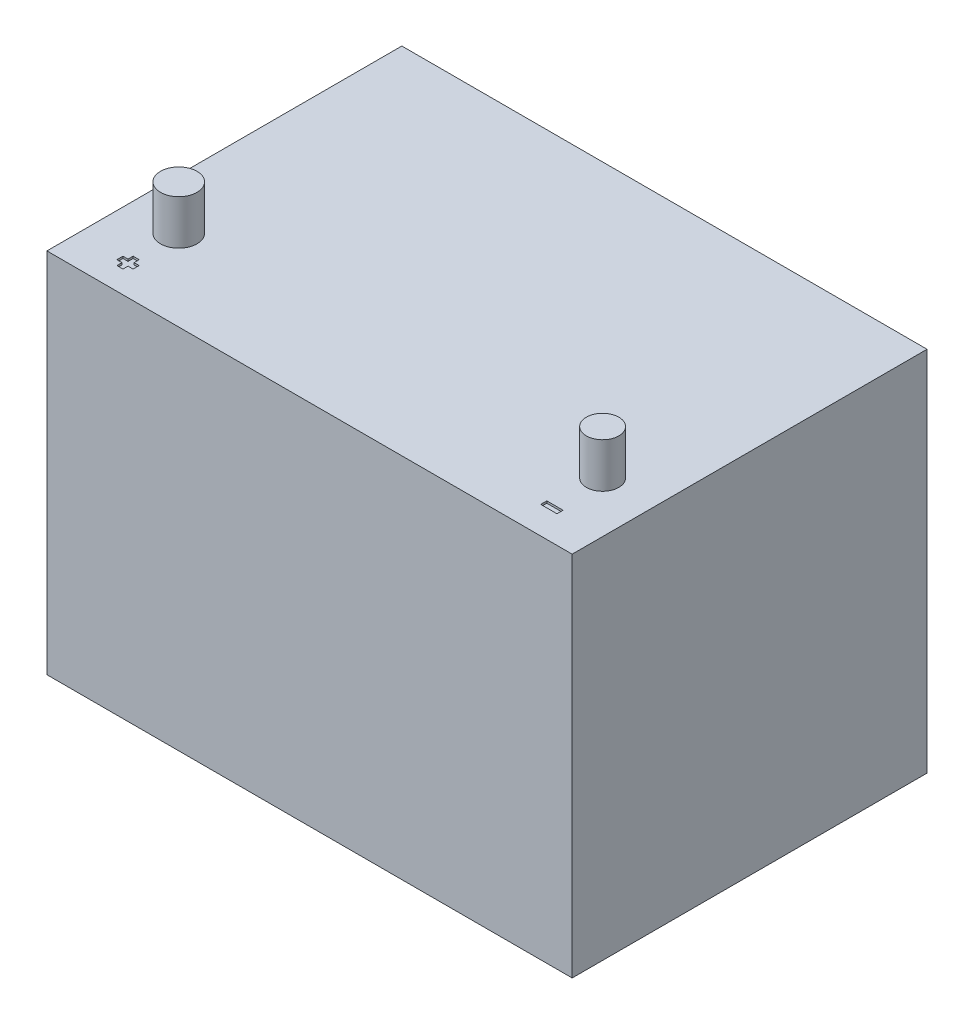
ISO-10303-21;
HEADER;
FILE_DESCRIPTION(('STEP AP214'),'2;1');
FILE_NAME('part.step','',(''),(''),'','','');
FILE_SCHEMA(('AUTOMOTIVE_DESIGN { 1 0 10303 214 1 1 1 1 }'));
ENDSEC;
DATA;
#1=APPLICATION_CONTEXT('core data for automotive mechanical design processes');
#2=APPLICATION_PROTOCOL_DEFINITION('international standard','automotive_design',2000,#1);
#3=PRODUCT_CONTEXT('',#1,'mechanical');
#4=PRODUCT('Part','Part','',(#3));
#5=PRODUCT_RELATED_PRODUCT_CATEGORY('part','',(#4));
#6=PRODUCT_DEFINITION_FORMATION('','',#4);
#7=PRODUCT_DEFINITION_CONTEXT('part definition',#1,'design');
#8=PRODUCT_DEFINITION('design','',#6,#7);
#9=PRODUCT_DEFINITION_SHAPE('','',#8);
#10=(LENGTH_UNIT() NAMED_UNIT(*) SI_UNIT(.MILLI.,.METRE.));
#11=(NAMED_UNIT(*) PLANE_ANGLE_UNIT() SI_UNIT($,.RADIAN.));
#12=(NAMED_UNIT(*) SI_UNIT($,.STERADIAN.) SOLID_ANGLE_UNIT());
#13=UNCERTAINTY_MEASURE_WITH_UNIT(LENGTH_MEASURE(1.E-05),#10,'distance_accuracy_value','');
#14=(GEOMETRIC_REPRESENTATION_CONTEXT(3) GLOBAL_UNCERTAINTY_ASSIGNED_CONTEXT((#13)) GLOBAL_UNIT_ASSIGNED_CONTEXT((#10,
#11,#12)) REPRESENTATION_CONTEXT('',''));
#15=CARTESIAN_POINT('',(0.,0.,0.));
#16=DIRECTION('',(0.,0.,1.));
#17=DIRECTION('',(1.,0.,0.));
#18=AXIS2_PLACEMENT_3D('',#15,#16,#17);
#19=CARTESIAN_POINT('',(129.5,181.,-87.5));
#20=DIRECTION('',(-1.,0.,0.));
#21=DIRECTION('',(0.,0.,1.));
#22=AXIS2_PLACEMENT_3D('',#19,#20,#21);
#23=PLANE('',#22);
#24=DIRECTION('',(0.,0.,-1.));
#25=VECTOR('',#24,1.);
#26=CARTESIAN_POINT('',(129.5,0.,-87.5));
#27=LINE('',#26,#25);
#28=CARTESIAN_POINT('',(129.5,0.,87.5));
#29=VERTEX_POINT('',#28);
#30=CARTESIAN_POINT('',(129.5,0.,-87.5));
#31=VERTEX_POINT('',#30);
#32=EDGE_CURVE('E303',#29,#31,#27,.T.);
#33=ORIENTED_EDGE('',*,*,#32,.T.);
#34=DIRECTION('',(0.,-1.,0.));
#35=VECTOR('',#34,1.);
#36=CARTESIAN_POINT('',(129.5,181.,-87.5));
#37=LINE('',#36,#35);
#38=CARTESIAN_POINT('',(129.5,181.,-87.5));
#39=VERTEX_POINT('',#38);
#40=EDGE_CURVE('E11',#39,#31,#37,.T.);
#41=ORIENTED_EDGE('',*,*,#40,.F.);
#42=DIRECTION('',(0.,0.,-1.));
#43=VECTOR('',#42,1.);
#44=CARTESIAN_POINT('',(129.5,181.,-87.5));
#45=LINE('',#44,#43);
#46=CARTESIAN_POINT('',(129.5,181.,87.5));
#47=VERTEX_POINT('',#46);
#48=EDGE_CURVE('E306',#47,#39,#45,.T.);
#49=ORIENTED_EDGE('',*,*,#48,.F.);
#50=DIRECTION('',(0.,-1.,0.));
#51=VECTOR('',#50,1.);
#52=CARTESIAN_POINT('',(129.5,181.,87.5));
#53=LINE('',#52,#51);
#54=EDGE_CURVE('E316',#47,#29,#53,.T.);
#55=ORIENTED_EDGE('',*,*,#54,.T.);
#56=EDGE_LOOP('',(#33,#41,#49,#55));
#57=FACE_BOUND('',#56,.T.);
#58=ADVANCED_FACE('F33',(#57),#23,.F.);
#59=CARTESIAN_POINT('',(-129.5,181.,-87.5));
#60=DIRECTION('',(0.,0.,1.));
#61=DIRECTION('',(1.,0.,0.));
#62=AXIS2_PLACEMENT_3D('',#59,#60,#61);
#63=PLANE('',#62);
#64=DIRECTION('',(-1.,0.,0.));
#65=VECTOR('',#64,1.);
#66=CARTESIAN_POINT('',(-129.5,0.,-87.5));
#67=LINE('',#66,#65);
#68=CARTESIAN_POINT('',(-129.5,0.,-87.5));
#69=VERTEX_POINT('',#68);
#70=EDGE_CURVE('E319',#31,#69,#67,.T.);
#71=ORIENTED_EDGE('',*,*,#70,.T.);
#72=DIRECTION('',(0.,-1.,0.));
#73=VECTOR('',#72,1.);
#74=CARTESIAN_POINT('',(-129.5,181.,-87.5));
#75=LINE('',#74,#73);
#76=CARTESIAN_POINT('',(-129.5,181.,-87.5));
#77=VERTEX_POINT('',#76);
#78=EDGE_CURVE('E40',#77,#69,#75,.T.);
#79=ORIENTED_EDGE('',*,*,#78,.F.);
#80=DIRECTION('',(-1.,0.,0.));
#81=VECTOR('',#80,1.);
#82=CARTESIAN_POINT('',(-129.5,181.,-87.5));
#83=LINE('',#82,#81);
#84=EDGE_CURVE('E309',#39,#77,#83,.T.);
#85=ORIENTED_EDGE('',*,*,#84,.F.);
#86=ORIENTED_EDGE('',*,*,#40,.T.);
#87=EDGE_LOOP('',(#71,#79,#85,#86));
#88=FACE_BOUND('',#87,.T.);
#89=ADVANCED_FACE('F349',(#88),#63,.F.);
#90=CARTESIAN_POINT('',(-129.5,181.,-87.5));
#91=DIRECTION('',(1.,0.,0.));
#92=DIRECTION('',(0.,0.,-1.));
#93=AXIS2_PLACEMENT_3D('',#90,#91,#92);
#94=PLANE('',#93);
#95=DIRECTION('',(0.,0.,1.));
#96=VECTOR('',#95,1.);
#97=CARTESIAN_POINT('',(-129.5,0.,-87.5));
#98=LINE('',#97,#96);
#99=CARTESIAN_POINT('',(-129.5,0.,87.5));
#100=VERTEX_POINT('',#99);
#101=EDGE_CURVE('E321',#69,#100,#98,.T.);
#102=ORIENTED_EDGE('',*,*,#101,.T.);
#103=DIRECTION('',(0.,-1.,0.));
#104=VECTOR('',#103,1.);
#105=CARTESIAN_POINT('',(-129.5,181.,87.5));
#106=LINE('',#105,#104);
#107=CARTESIAN_POINT('',(-129.5,181.,87.5));
#108=VERTEX_POINT('',#107);
#109=EDGE_CURVE('E326',#108,#100,#106,.T.);
#110=ORIENTED_EDGE('',*,*,#109,.F.);
#111=DIRECTION('',(0.,0.,1.));
#112=VECTOR('',#111,1.);
#113=CARTESIAN_POINT('',(-129.5,181.,-87.5));
#114=LINE('',#113,#112);
#115=EDGE_CURVE('E312',#77,#108,#114,.T.);
#116=ORIENTED_EDGE('',*,*,#115,.F.);
#117=ORIENTED_EDGE('',*,*,#78,.T.);
#118=EDGE_LOOP('',(#102,#110,#116,#117));
#119=FACE_BOUND('',#118,.T.);
#120=ADVANCED_FACE('F333',(#119),#94,.F.);
#121=CARTESIAN_POINT('',(-129.5,181.,87.5));
#122=DIRECTION('',(0.,0.,-1.));
#123=DIRECTION('',(-1.,0.,0.));
#124=AXIS2_PLACEMENT_3D('',#121,#122,#123);
#125=PLANE('',#124);
#126=DIRECTION('',(1.,0.,0.));
#127=VECTOR('',#126,1.);
#128=CARTESIAN_POINT('',(-129.5,0.,87.5));
#129=LINE('',#128,#127);
#130=EDGE_CURVE('E310',#100,#29,#129,.T.);
#131=ORIENTED_EDGE('',*,*,#130,.T.);
#132=ORIENTED_EDGE('',*,*,#54,.F.);
#133=DIRECTION('',(1.,0.,0.));
#134=VECTOR('',#133,1.);
#135=CARTESIAN_POINT('',(-129.5,181.,87.5));
#136=LINE('',#135,#134);
#137=EDGE_CURVE('E314',#108,#47,#136,.T.);
#138=ORIENTED_EDGE('',*,*,#137,.F.);
#139=ORIENTED_EDGE('',*,*,#109,.T.);
#140=EDGE_LOOP('',(#131,#132,#138,#139));
#141=FACE_BOUND('',#140,.T.);
#142=ADVANCED_FACE('F342',(#141),#125,.F.);
#143=CARTESIAN_POINT('',(0.,181.,0.));
#144=DIRECTION('',(0.,1.,0.));
#145=DIRECTION('',(0.,0.,1.));
#146=AXIS2_PLACEMENT_3D('',#143,#144,#145);
#147=PLANE('',#146);
#148=DIRECTION('',(0.,0.,1.));
#149=VECTOR('',#148,1.);
#150=CARTESIAN_POINT('',(-108.5,181.,0.));
#151=LINE('',#150,#149);
#152=CARTESIAN_POINT('',(-108.5,181.,71.));
#153=VERTEX_POINT('',#152);
#154=CARTESIAN_POINT('',(-108.5,181.,74.));
#155=VERTEX_POINT('',#154);
#156=EDGE_CURVE('E47',#153,#155,#151,.T.);
#157=ORIENTED_EDGE('',*,*,#156,.F.);
#158=DIRECTION('',(1.,0.,0.));
#159=VECTOR('',#158,1.);
#160=CARTESIAN_POINT('',(0.,181.,71.));
#161=LINE('',#160,#159);
#162=CARTESIAN_POINT('',(-106.,181.,71.));
#163=VERTEX_POINT('',#162);
#164=EDGE_CURVE('E189',#153,#163,#161,.T.);
#165=ORIENTED_EDGE('',*,*,#164,.T.);
#166=DIRECTION('',(0.,0.,1.));
#167=VECTOR('',#166,1.);
#168=CARTESIAN_POINT('',(-106.,181.,0.));
#169=LINE('',#168,#167);
#170=CARTESIAN_POINT('',(-106.,181.,68.5));
#171=VERTEX_POINT('',#170);
#172=EDGE_CURVE('E192',#171,#163,#169,.T.);
#173=ORIENTED_EDGE('',*,*,#172,.F.);
#174=DIRECTION('',(1.,0.,0.));
#175=VECTOR('',#174,1.);
#176=CARTESIAN_POINT('',(0.,181.,68.5));
#177=LINE('',#176,#175);
#178=CARTESIAN_POINT('',(-103.,181.,68.5));
#179=VERTEX_POINT('',#178);
#180=EDGE_CURVE('E240',#171,#179,#177,.T.);
#181=ORIENTED_EDGE('',*,*,#180,.T.);
#182=DIRECTION('',(0.,0.,1.));
#183=VECTOR('',#182,1.);
#184=CARTESIAN_POINT('',(-103.,181.,0.));
#185=LINE('',#184,#183);
#186=CARTESIAN_POINT('',(-103.,181.,71.));
#187=VERTEX_POINT('',#186);
#188=EDGE_CURVE('E237',#179,#187,#185,.T.);
#189=ORIENTED_EDGE('',*,*,#188,.T.);
#190=DIRECTION('',(1.,0.,0.));
#191=VECTOR('',#190,1.);
#192=CARTESIAN_POINT('',(0.,181.,71.));
#193=LINE('',#192,#191);
#194=CARTESIAN_POINT('',(-100.5,181.,71.));
#195=VERTEX_POINT('',#194);
#196=EDGE_CURVE('E234',#187,#195,#193,.T.);
#197=ORIENTED_EDGE('',*,*,#196,.T.);
#198=DIRECTION('',(0.,0.,1.));
#199=VECTOR('',#198,1.);
#200=CARTESIAN_POINT('',(-100.5,181.,0.));
#201=LINE('',#200,#199);
#202=CARTESIAN_POINT('',(-100.5,181.,74.));
#203=VERTEX_POINT('',#202);
#204=EDGE_CURVE('E231',#195,#203,#201,.T.);
#205=ORIENTED_EDGE('',*,*,#204,.T.);
#206=DIRECTION('',(1.,0.,0.));
#207=VECTOR('',#206,1.);
#208=CARTESIAN_POINT('',(0.,181.,74.));
#209=LINE('',#208,#207);
#210=CARTESIAN_POINT('',(-103.,181.,74.));
#211=VERTEX_POINT('',#210);
#212=EDGE_CURVE('E228',#211,#203,#209,.T.);
#213=ORIENTED_EDGE('',*,*,#212,.F.);
#214=DIRECTION('',(0.,0.,1.));
#215=VECTOR('',#214,1.);
#216=CARTESIAN_POINT('',(-103.,181.,0.));
#217=LINE('',#216,#215);
#218=CARTESIAN_POINT('',(-103.,181.,76.5));
#219=VERTEX_POINT('',#218);
#220=EDGE_CURVE('E225',#211,#219,#217,.T.);
#221=ORIENTED_EDGE('',*,*,#220,.T.);
#222=DIRECTION('',(1.,0.,0.));
#223=VECTOR('',#222,1.);
#224=CARTESIAN_POINT('',(0.,181.,76.5));
#225=LINE('',#224,#223);
#226=CARTESIAN_POINT('',(-106.,181.,76.5));
#227=VERTEX_POINT('',#226);
#228=EDGE_CURVE('E222',#227,#219,#225,.T.);
#229=ORIENTED_EDGE('',*,*,#228,.F.);
#230=DIRECTION('',(0.,0.,1.));
#231=VECTOR('',#230,1.);
#232=CARTESIAN_POINT('',(-106.,181.,0.));
#233=LINE('',#232,#231);
#234=CARTESIAN_POINT('',(-106.,181.,74.));
#235=VERTEX_POINT('',#234);
#236=EDGE_CURVE('E219',#235,#227,#233,.T.);
#237=ORIENTED_EDGE('',*,*,#236,.F.);
#238=DIRECTION('',(1.,0.,0.));
#239=VECTOR('',#238,1.);
#240=CARTESIAN_POINT('',(0.,181.,74.));
#241=LINE('',#240,#239);
#242=EDGE_CURVE('E216',#155,#235,#241,.T.);
#243=ORIENTED_EDGE('',*,*,#242,.F.);
#244=EDGE_LOOP('',(#157,#165,#173,#181,#189,#197,#205,#213,#221,#229,#237,#243));
#245=FACE_BOUND('',#244,.T.);
#246=DIRECTION('',(1.,0.,0.));
#247=VECTOR('',#246,1.);
#248=CARTESIAN_POINT('',(0.,181.,74.));
#249=LINE('',#248,#247);
#250=CARTESIAN_POINT('',(100.5,181.,74.));
#251=VERTEX_POINT('',#250);
#252=CARTESIAN_POINT('',(108.5,181.,74.));
#253=VERTEX_POINT('',#252);
#254=EDGE_CURVE('E55',#251,#253,#249,.T.);
#255=ORIENTED_EDGE('',*,*,#254,.F.);
#256=DIRECTION('',(0.,0.,-1.));
#257=VECTOR('',#256,1.);
#258=CARTESIAN_POINT('',(100.5,181.,0.));
#259=LINE('',#258,#257);
#260=CARTESIAN_POINT('',(100.5,181.,71.));
#261=VERTEX_POINT('',#260);
#262=EDGE_CURVE('E271',#251,#261,#259,.T.);
#263=ORIENTED_EDGE('',*,*,#262,.T.);
#264=DIRECTION('',(1.,0.,0.));
#265=VECTOR('',#264,1.);
#266=CARTESIAN_POINT('',(0.,181.,71.));
#267=LINE('',#266,#265);
#268=CARTESIAN_POINT('',(108.5,181.,71.));
#269=VERTEX_POINT('',#268);
#270=EDGE_CURVE('E283',#261,#269,#267,.T.);
#271=ORIENTED_EDGE('',*,*,#270,.T.);
#272=DIRECTION('',(0.,0.,-1.));
#273=VECTOR('',#272,1.);
#274=CARTESIAN_POINT('',(108.5,181.,0.));
#275=LINE('',#274,#273);
#276=EDGE_CURVE('E280',#253,#269,#275,.T.);
#277=ORIENTED_EDGE('',*,*,#276,.F.);
#278=EDGE_LOOP('',(#255,#263,#271,#277));
#279=FACE_BOUND('',#278,.T.);
#280=CARTESIAN_POINT('',(104.5,181.,47.5));
#281=DIRECTION('',(0.,1.,0.));
#282=DIRECTION('',(0.,0.,1.));
#283=AXIS2_PLACEMENT_3D('',#280,#281,#282);
#284=CIRCLE('',#283,8.00000000000001);
#285=CARTESIAN_POINT('',(104.5,181.,55.5));
#286=VERTEX_POINT('',#285);
#287=EDGE_CURVE('E247',#286,#286,#284,.T.);
#288=ORIENTED_EDGE('',*,*,#287,.F.);
#289=EDGE_LOOP('',(#288));
#290=FACE_BOUND('',#289,.T.);
#291=CARTESIAN_POINT('',(-104.5,181.,47.5));
#292=DIRECTION('',(0.,1.,0.));
#293=DIRECTION('',(0.,0.,1.));
#294=AXIS2_PLACEMENT_3D('',#291,#292,#293);
#295=CIRCLE('',#294,9.);
#296=CARTESIAN_POINT('',(-104.5,181.,56.5));
#297=VERTEX_POINT('',#296);
#298=EDGE_CURVE('E297',#297,#297,#295,.T.);
#299=ORIENTED_EDGE('',*,*,#298,.F.);
#300=EDGE_LOOP('',(#299));
#301=FACE_BOUND('',#300,.T.);
#302=ORIENTED_EDGE('',*,*,#48,.T.);
#303=ORIENTED_EDGE('',*,*,#84,.T.);
#304=ORIENTED_EDGE('',*,*,#115,.T.);
#305=ORIENTED_EDGE('',*,*,#137,.T.);
#306=EDGE_LOOP('',(#302,#303,#304,#305));
#307=FACE_BOUND('',#306,.T.);
#308=ADVANCED_FACE('F348',(#245,#279,#290,#301,#307),#147,.T.);
#309=CARTESIAN_POINT('',(0.,0.,0.));
#310=DIRECTION('',(0.,1.,0.));
#311=DIRECTION('',(0.,0.,1.));
#312=AXIS2_PLACEMENT_3D('',#309,#310,#311);
#313=PLANE('',#312);
#314=ORIENTED_EDGE('',*,*,#32,.F.);
#315=ORIENTED_EDGE('',*,*,#130,.F.);
#316=ORIENTED_EDGE('',*,*,#101,.F.);
#317=ORIENTED_EDGE('',*,*,#70,.F.);
#318=EDGE_LOOP('',(#314,#315,#316,#317));
#319=FACE_BOUND('',#318,.T.);
#320=ADVANCED_FACE('F339',(#319),#313,.F.);
#321=CARTESIAN_POINT('',(-104.5,203.,47.5));
#322=DIRECTION('',(0.,-1.,0.));
#323=DIRECTION('',(0.,0.,-1.));
#324=AXIS2_PLACEMENT_3D('',#321,#322,#323);
#325=CYLINDRICAL_SURFACE('',#324,9.);
#326=CARTESIAN_POINT('',(-104.5,203.,47.5));
#327=DIRECTION('',(0.,1.,0.));
#328=DIRECTION('',(0.,0.,1.));
#329=AXIS2_PLACEMENT_3D('',#326,#327,#328);
#330=CIRCLE('',#329,9.);
#331=CARTESIAN_POINT('',(-104.5,203.,56.5));
#332=VERTEX_POINT('',#331);
#333=EDGE_CURVE('E300',#332,#332,#330,.T.);
#334=ORIENTED_EDGE('',*,*,#333,.F.);
#335=EDGE_LOOP('',(#334));
#336=FACE_BOUND('',#335,.T.);
#337=ORIENTED_EDGE('',*,*,#298,.T.);
#338=EDGE_LOOP('',(#337));
#339=FACE_BOUND('',#338,.T.);
#340=ADVANCED_FACE('F361',(#336,#339),#325,.T.);
#341=CARTESIAN_POINT('',(-104.5,203.,47.5));
#342=DIRECTION('',(0.,1.,0.));
#343=DIRECTION('',(0.,0.,1.));
#344=AXIS2_PLACEMENT_3D('',#341,#342,#343);
#345=PLANE('',#344);
#346=ORIENTED_EDGE('',*,*,#333,.T.);
#347=EDGE_LOOP('',(#346));
#348=FACE_BOUND('',#347,.T.);
#349=ADVANCED_FACE('F367',(#348),#345,.T.);
#350=CARTESIAN_POINT('',(104.5,203.,47.5));
#351=DIRECTION('',(0.,-1.,0.));
#352=DIRECTION('',(0.,0.,-1.));
#353=AXIS2_PLACEMENT_3D('',#350,#351,#352);
#354=CYLINDRICAL_SURFACE('',#353,8.00000000000001);
#355=CARTESIAN_POINT('',(104.5,203.,47.5));
#356=DIRECTION('',(0.,1.,0.));
#357=DIRECTION('',(0.,0.,1.));
#358=AXIS2_PLACEMENT_3D('',#355,#356,#357);
#359=CIRCLE('',#358,8.00000000000001);
#360=CARTESIAN_POINT('',(104.5,203.,55.5));
#361=VERTEX_POINT('',#360);
#362=EDGE_CURVE('E294',#361,#361,#359,.T.);
#363=ORIENTED_EDGE('',*,*,#362,.F.);
#364=EDGE_LOOP('',(#363));
#365=FACE_BOUND('',#364,.T.);
#366=ORIENTED_EDGE('',*,*,#287,.T.);
#367=EDGE_LOOP('',(#366));
#368=FACE_BOUND('',#367,.T.);
#369=ADVANCED_FACE('F371',(#365,#368),#354,.T.);
#370=CARTESIAN_POINT('',(104.5,203.,47.5));
#371=DIRECTION('',(0.,1.,0.));
#372=DIRECTION('',(0.,0.,1.));
#373=AXIS2_PLACEMENT_3D('',#370,#371,#372);
#374=PLANE('',#373);
#375=ORIENTED_EDGE('',*,*,#362,.T.);
#376=EDGE_LOOP('',(#375));
#377=FACE_BOUND('',#376,.T.);
#378=ADVANCED_FACE('F375',(#377),#374,.T.);
#379=CARTESIAN_POINT('',(0.,180.,74.));
#380=DIRECTION('',(0.,0.,1.));
#381=DIRECTION('',(1.,0.,0.));
#382=AXIS2_PLACEMENT_3D('',#379,#380,#381);
#383=PLANE('',#382);
#384=ORIENTED_EDGE('',*,*,#254,.T.);
#385=DIRECTION('',(0.,1.,0.));
#386=VECTOR('',#385,1.);
#387=CARTESIAN_POINT('',(108.5,180.,74.));
#388=LINE('',#387,#386);
#389=CARTESIAN_POINT('',(108.5,180.,74.));
#390=VERTEX_POINT('',#389);
#391=EDGE_CURVE('E278',#390,#253,#388,.T.);
#392=ORIENTED_EDGE('',*,*,#391,.F.);
#393=DIRECTION('',(1.,0.,0.));
#394=VECTOR('',#393,1.);
#395=CARTESIAN_POINT('',(0.,180.,74.));
#396=LINE('',#395,#394);
#397=CARTESIAN_POINT('',(100.5,180.,74.));
#398=VERTEX_POINT('',#397);
#399=EDGE_CURVE('E267',#398,#390,#396,.T.);
#400=ORIENTED_EDGE('',*,*,#399,.F.);
#401=DIRECTION('',(0.,1.,0.));
#402=VECTOR('',#401,1.);
#403=CARTESIAN_POINT('',(100.5,180.,74.));
#404=LINE('',#403,#402);
#405=EDGE_CURVE('E217',#398,#251,#404,.T.);
#406=ORIENTED_EDGE('',*,*,#405,.T.);
#407=EDGE_LOOP('',(#384,#392,#400,#406));
#408=FACE_BOUND('',#407,.T.);
#409=ADVANCED_FACE('F379',(#408),#383,.F.);
#410=CARTESIAN_POINT('',(100.5,180.,0.));
#411=DIRECTION('',(1.,0.,0.));
#412=DIRECTION('',(0.,0.,-1.));
#413=AXIS2_PLACEMENT_3D('',#410,#411,#412);
#414=PLANE('',#413);
#415=ORIENTED_EDGE('',*,*,#262,.F.);
#416=ORIENTED_EDGE('',*,*,#405,.F.);
#417=DIRECTION('',(0.,0.,-1.));
#418=VECTOR('',#417,1.);
#419=CARTESIAN_POINT('',(100.5,180.,0.));
#420=LINE('',#419,#418);
#421=CARTESIAN_POINT('',(100.5,180.,71.));
#422=VERTEX_POINT('',#421);
#423=EDGE_CURVE('E276',#398,#422,#420,.T.);
#424=ORIENTED_EDGE('',*,*,#423,.T.);
#425=DIRECTION('',(0.,1.,0.));
#426=VECTOR('',#425,1.);
#427=CARTESIAN_POINT('',(100.5,180.,71.));
#428=LINE('',#427,#426);
#429=EDGE_CURVE('E289',#422,#261,#428,.T.);
#430=ORIENTED_EDGE('',*,*,#429,.T.);
#431=EDGE_LOOP('',(#415,#416,#424,#430));
#432=FACE_BOUND('',#431,.T.);
#433=ADVANCED_FACE('F383',(#432),#414,.T.);
#434=CARTESIAN_POINT('',(0.,180.,71.));
#435=DIRECTION('',(0.,0.,1.));
#436=DIRECTION('',(1.,0.,0.));
#437=AXIS2_PLACEMENT_3D('',#434,#435,#436);
#438=PLANE('',#437);
#439=ORIENTED_EDGE('',*,*,#270,.F.);
#440=ORIENTED_EDGE('',*,*,#429,.F.);
#441=DIRECTION('',(1.,0.,0.));
#442=VECTOR('',#441,1.);
#443=CARTESIAN_POINT('',(0.,180.,71.));
#444=LINE('',#443,#442);
#445=CARTESIAN_POINT('',(108.5,180.,71.));
#446=VERTEX_POINT('',#445);
#447=EDGE_CURVE('E274',#422,#446,#444,.T.);
#448=ORIENTED_EDGE('',*,*,#447,.T.);
#449=DIRECTION('',(0.,1.,0.));
#450=VECTOR('',#449,1.);
#451=CARTESIAN_POINT('',(108.5,180.,71.));
#452=LINE('',#451,#450);
#453=EDGE_CURVE('E291',#446,#269,#452,.T.);
#454=ORIENTED_EDGE('',*,*,#453,.T.);
#455=EDGE_LOOP('',(#439,#440,#448,#454));
#456=FACE_BOUND('',#455,.T.);
#457=ADVANCED_FACE('F388',(#456),#438,.T.);
#458=CARTESIAN_POINT('',(108.5,180.,0.));
#459=DIRECTION('',(1.,0.,0.));
#460=DIRECTION('',(0.,0.,-1.));
#461=AXIS2_PLACEMENT_3D('',#458,#459,#460);
#462=PLANE('',#461);
#463=ORIENTED_EDGE('',*,*,#276,.T.);
#464=ORIENTED_EDGE('',*,*,#453,.F.);
#465=DIRECTION('',(0.,0.,-1.));
#466=VECTOR('',#465,1.);
#467=CARTESIAN_POINT('',(108.5,180.,0.));
#468=LINE('',#467,#466);
#469=EDGE_CURVE('E270',#390,#446,#468,.T.);
#470=ORIENTED_EDGE('',*,*,#469,.F.);
#471=ORIENTED_EDGE('',*,*,#391,.T.);
#472=EDGE_LOOP('',(#463,#464,#470,#471));
#473=FACE_BOUND('',#472,.T.);
#474=ADVANCED_FACE('F384',(#473),#462,.F.);
#475=CARTESIAN_POINT('',(0.,180.,0.));
#476=DIRECTION('',(0.,1.,0.));
#477=DIRECTION('',(0.,0.,1.));
#478=AXIS2_PLACEMENT_3D('',#475,#476,#477);
#479=PLANE('',#478);
#480=ORIENTED_EDGE('',*,*,#399,.T.);
#481=ORIENTED_EDGE('',*,*,#469,.T.);
#482=ORIENTED_EDGE('',*,*,#447,.F.);
#483=ORIENTED_EDGE('',*,*,#423,.F.);
#484=EDGE_LOOP('',(#480,#481,#482,#483));
#485=FACE_BOUND('',#484,.T.);
#486=ADVANCED_FACE('F387',(#485),#479,.T.);
#487=CARTESIAN_POINT('',(-108.5,180.,0.));
#488=DIRECTION('',(-1.,0.,0.));
#489=DIRECTION('',(0.,0.,1.));
#490=AXIS2_PLACEMENT_3D('',#487,#488,#489);
#491=PLANE('',#490);
#492=ORIENTED_EDGE('',*,*,#156,.T.);
#493=DIRECTION('',(0.,1.,0.));
#494=VECTOR('',#493,1.);
#495=CARTESIAN_POINT('',(-108.5,180.,74.));
#496=LINE('',#495,#494);
#497=CARTESIAN_POINT('',(-108.5,180.,74.));
#498=VERTEX_POINT('',#497);
#499=EDGE_CURVE('E167',#498,#155,#496,.T.);
#500=ORIENTED_EDGE('',*,*,#499,.F.);
#501=DIRECTION('',(0.,0.,1.));
#502=VECTOR('',#501,1.);
#503=CARTESIAN_POINT('',(-108.5,180.,0.));
#504=LINE('',#503,#502);
#505=CARTESIAN_POINT('',(-108.5,180.,71.));
#506=VERTEX_POINT('',#505);
#507=EDGE_CURVE('E171',#506,#498,#504,.T.);
#508=ORIENTED_EDGE('',*,*,#507,.F.);
#509=DIRECTION('',(0.,1.,0.));
#510=VECTOR('',#509,1.);
#511=CARTESIAN_POINT('',(-108.5,180.,71.));
#512=LINE('',#511,#510);
#513=EDGE_CURVE('E245',#506,#153,#512,.T.);
#514=ORIENTED_EDGE('',*,*,#513,.T.);
#515=EDGE_LOOP('',(#492,#500,#508,#514));
#516=FACE_BOUND('',#515,.T.);
#517=ADVANCED_FACE('F169',(#516),#491,.F.);
#518=CARTESIAN_POINT('',(0.,180.,71.));
#519=DIRECTION('',(0.,0.,1.));
#520=DIRECTION('',(1.,0.,0.));
#521=AXIS2_PLACEMENT_3D('',#518,#519,#520);
#522=PLANE('',#521);
#523=ORIENTED_EDGE('',*,*,#164,.F.);
#524=ORIENTED_EDGE('',*,*,#513,.F.);
#525=DIRECTION('',(1.,0.,0.));
#526=VECTOR('',#525,1.);
#527=CARTESIAN_POINT('',(0.,180.,71.));
#528=LINE('',#527,#526);
#529=CARTESIAN_POINT('',(-106.,180.,71.));
#530=VERTEX_POINT('',#529);
#531=EDGE_CURVE('E176',#506,#530,#528,.T.);
#532=ORIENTED_EDGE('',*,*,#531,.T.);
#533=DIRECTION('',(0.,1.,0.));
#534=VECTOR('',#533,1.);
#535=CARTESIAN_POINT('',(-106.,180.,71.));
#536=LINE('',#535,#534);
#537=EDGE_CURVE('E248',#530,#163,#536,.T.);
#538=ORIENTED_EDGE('',*,*,#537,.T.);
#539=EDGE_LOOP('',(#523,#524,#532,#538));
#540=FACE_BOUND('',#539,.T.);
#541=ADVANCED_FACE('F401',(#540),#522,.T.);
#542=CARTESIAN_POINT('',(-106.,180.,0.));
#543=DIRECTION('',(-1.,0.,0.));
#544=DIRECTION('',(0.,0.,1.));
#545=AXIS2_PLACEMENT_3D('',#542,#543,#544);
#546=PLANE('',#545);
#547=ORIENTED_EDGE('',*,*,#172,.T.);
#548=ORIENTED_EDGE('',*,*,#537,.F.);
#549=DIRECTION('',(0.,0.,1.));
#550=VECTOR('',#549,1.);
#551=CARTESIAN_POINT('',(-106.,180.,0.));
#552=LINE('',#551,#550);
#553=CARTESIAN_POINT('',(-106.,180.,68.5));
#554=VERTEX_POINT('',#553);
#555=EDGE_CURVE('E212',#554,#530,#552,.T.);
#556=ORIENTED_EDGE('',*,*,#555,.F.);
#557=DIRECTION('',(0.,1.,0.));
#558=VECTOR('',#557,1.);
#559=CARTESIAN_POINT('',(-106.,180.,68.5));
#560=LINE('',#559,#558);
#561=EDGE_CURVE('E250',#554,#171,#560,.T.);
#562=ORIENTED_EDGE('',*,*,#561,.T.);
#563=EDGE_LOOP('',(#547,#548,#556,#562));
#564=FACE_BOUND('',#563,.T.);
#565=ADVANCED_FACE('F435',(#564),#546,.F.);
#566=CARTESIAN_POINT('',(0.,180.,68.5));
#567=DIRECTION('',(0.,0.,1.));
#568=DIRECTION('',(1.,0.,0.));
#569=AXIS2_PLACEMENT_3D('',#566,#567,#568);
#570=PLANE('',#569);
#571=ORIENTED_EDGE('',*,*,#180,.F.);
#572=ORIENTED_EDGE('',*,*,#561,.F.);
#573=DIRECTION('',(1.,0.,0.));
#574=VECTOR('',#573,1.);
#575=CARTESIAN_POINT('',(0.,180.,68.5));
#576=LINE('',#575,#574);
#577=CARTESIAN_POINT('',(-103.,180.,68.5));
#578=VERTEX_POINT('',#577);
#579=EDGE_CURVE('E210',#554,#578,#576,.T.);
#580=ORIENTED_EDGE('',*,*,#579,.T.);
#581=DIRECTION('',(0.,1.,0.));
#582=VECTOR('',#581,1.);
#583=CARTESIAN_POINT('',(-103.,180.,68.5));
#584=LINE('',#583,#582);
#585=EDGE_CURVE('E252',#578,#179,#584,.T.);
#586=ORIENTED_EDGE('',*,*,#585,.T.);
#587=EDGE_LOOP('',(#571,#572,#580,#586));
#588=FACE_BOUND('',#587,.T.);
#589=ADVANCED_FACE('F431',(#588),#570,.T.);
#590=CARTESIAN_POINT('',(-103.,180.,0.));
#591=DIRECTION('',(-1.,0.,0.));
#592=DIRECTION('',(0.,0.,1.));
#593=AXIS2_PLACEMENT_3D('',#590,#591,#592);
#594=PLANE('',#593);
#595=ORIENTED_EDGE('',*,*,#188,.F.);
#596=ORIENTED_EDGE('',*,*,#585,.F.);
#597=DIRECTION('',(0.,0.,1.));
#598=VECTOR('',#597,1.);
#599=CARTESIAN_POINT('',(-103.,180.,0.));
#600=LINE('',#599,#598);
#601=CARTESIAN_POINT('',(-103.,180.,71.));
#602=VERTEX_POINT('',#601);
#603=EDGE_CURVE('E208',#578,#602,#600,.T.);
#604=ORIENTED_EDGE('',*,*,#603,.T.);
#605=DIRECTION('',(0.,1.,0.));
#606=VECTOR('',#605,1.);
#607=CARTESIAN_POINT('',(-103.,180.,71.));
#608=LINE('',#607,#606);
#609=EDGE_CURVE('E254',#602,#187,#608,.T.);
#610=ORIENTED_EDGE('',*,*,#609,.T.);
#611=EDGE_LOOP('',(#595,#596,#604,#610));
#612=FACE_BOUND('',#611,.T.);
#613=ADVANCED_FACE('F427',(#612),#594,.T.);
#614=CARTESIAN_POINT('',(0.,180.,71.));
#615=DIRECTION('',(0.,0.,1.));
#616=DIRECTION('',(1.,0.,0.));
#617=AXIS2_PLACEMENT_3D('',#614,#615,#616);
#618=PLANE('',#617);
#619=ORIENTED_EDGE('',*,*,#196,.F.);
#620=ORIENTED_EDGE('',*,*,#609,.F.);
#621=DIRECTION('',(1.,0.,0.));
#622=VECTOR('',#621,1.);
#623=CARTESIAN_POINT('',(0.,180.,71.));
#624=LINE('',#623,#622);
#625=CARTESIAN_POINT('',(-100.5,180.,71.));
#626=VERTEX_POINT('',#625);
#627=EDGE_CURVE('E206',#602,#626,#624,.T.);
#628=ORIENTED_EDGE('',*,*,#627,.T.);
#629=DIRECTION('',(0.,1.,0.));
#630=VECTOR('',#629,1.);
#631=CARTESIAN_POINT('',(-100.5,180.,71.));
#632=LINE('',#631,#630);
#633=EDGE_CURVE('E256',#626,#195,#632,.T.);
#634=ORIENTED_EDGE('',*,*,#633,.T.);
#635=EDGE_LOOP('',(#619,#620,#628,#634));
#636=FACE_BOUND('',#635,.T.);
#637=ADVANCED_FACE('F423',(#636),#618,.T.);
#638=CARTESIAN_POINT('',(-100.5,180.,0.));
#639=DIRECTION('',(-1.,0.,0.));
#640=DIRECTION('',(0.,0.,1.));
#641=AXIS2_PLACEMENT_3D('',#638,#639,#640);
#642=PLANE('',#641);
#643=ORIENTED_EDGE('',*,*,#204,.F.);
#644=ORIENTED_EDGE('',*,*,#633,.F.);
#645=DIRECTION('',(0.,0.,1.));
#646=VECTOR('',#645,1.);
#647=CARTESIAN_POINT('',(-100.5,180.,0.));
#648=LINE('',#647,#646);
#649=CARTESIAN_POINT('',(-100.5,180.,74.));
#650=VERTEX_POINT('',#649);
#651=EDGE_CURVE('E204',#626,#650,#648,.T.);
#652=ORIENTED_EDGE('',*,*,#651,.T.);
#653=DIRECTION('',(0.,1.,0.));
#654=VECTOR('',#653,1.);
#655=CARTESIAN_POINT('',(-100.5,180.,74.));
#656=LINE('',#655,#654);
#657=EDGE_CURVE('E258',#650,#203,#656,.T.);
#658=ORIENTED_EDGE('',*,*,#657,.T.);
#659=EDGE_LOOP('',(#643,#644,#652,#658));
#660=FACE_BOUND('',#659,.T.);
#661=ADVANCED_FACE('F419',(#660),#642,.T.);
#662=CARTESIAN_POINT('',(0.,180.,74.));
#663=DIRECTION('',(0.,0.,1.));
#664=DIRECTION('',(1.,0.,0.));
#665=AXIS2_PLACEMENT_3D('',#662,#663,#664);
#666=PLANE('',#665);
#667=ORIENTED_EDGE('',*,*,#212,.T.);
#668=ORIENTED_EDGE('',*,*,#657,.F.);
#669=DIRECTION('',(1.,0.,0.));
#670=VECTOR('',#669,1.);
#671=CARTESIAN_POINT('',(0.,180.,74.));
#672=LINE('',#671,#670);
#673=CARTESIAN_POINT('',(-103.,180.,74.));
#674=VERTEX_POINT('',#673);
#675=EDGE_CURVE('E201',#674,#650,#672,.T.);
#676=ORIENTED_EDGE('',*,*,#675,.F.);
#677=DIRECTION('',(0.,1.,0.));
#678=VECTOR('',#677,1.);
#679=CARTESIAN_POINT('',(-103.,180.,74.));
#680=LINE('',#679,#678);
#681=EDGE_CURVE('E260',#674,#211,#680,.T.);
#682=ORIENTED_EDGE('',*,*,#681,.T.);
#683=EDGE_LOOP('',(#667,#668,#676,#682));
#684=FACE_BOUND('',#683,.T.);
#685=ADVANCED_FACE('F415',(#684),#666,.F.);
#686=CARTESIAN_POINT('',(-103.,180.,0.));
#687=DIRECTION('',(-1.,0.,0.));
#688=DIRECTION('',(0.,0.,1.));
#689=AXIS2_PLACEMENT_3D('',#686,#687,#688);
#690=PLANE('',#689);
#691=ORIENTED_EDGE('',*,*,#220,.F.);
#692=ORIENTED_EDGE('',*,*,#681,.F.);
#693=DIRECTION('',(0.,0.,1.));
#694=VECTOR('',#693,1.);
#695=CARTESIAN_POINT('',(-103.,180.,0.));
#696=LINE('',#695,#694);
#697=CARTESIAN_POINT('',(-103.,180.,76.5));
#698=VERTEX_POINT('',#697);
#699=EDGE_CURVE('E199',#674,#698,#696,.T.);
#700=ORIENTED_EDGE('',*,*,#699,.T.);
#701=DIRECTION('',(0.,1.,0.));
#702=VECTOR('',#701,1.);
#703=CARTESIAN_POINT('',(-103.,180.,76.5));
#704=LINE('',#703,#702);
#705=EDGE_CURVE('E262',#698,#219,#704,.T.);
#706=ORIENTED_EDGE('',*,*,#705,.T.);
#707=EDGE_LOOP('',(#691,#692,#700,#706));
#708=FACE_BOUND('',#707,.T.);
#709=ADVANCED_FACE('F411',(#708),#690,.T.);
#710=CARTESIAN_POINT('',(0.,180.,76.5));
#711=DIRECTION('',(0.,0.,1.));
#712=DIRECTION('',(1.,0.,0.));
#713=AXIS2_PLACEMENT_3D('',#710,#711,#712);
#714=PLANE('',#713);
#715=ORIENTED_EDGE('',*,*,#228,.T.);
#716=ORIENTED_EDGE('',*,*,#705,.F.);
#717=DIRECTION('',(1.,0.,0.));
#718=VECTOR('',#717,1.);
#719=CARTESIAN_POINT('',(0.,180.,76.5));
#720=LINE('',#719,#718);
#721=CARTESIAN_POINT('',(-106.,180.,76.5));
#722=VERTEX_POINT('',#721);
#723=EDGE_CURVE('E196',#722,#698,#720,.T.);
#724=ORIENTED_EDGE('',*,*,#723,.F.);
#725=DIRECTION('',(0.,1.,0.));
#726=VECTOR('',#725,1.);
#727=CARTESIAN_POINT('',(-106.,180.,76.5));
#728=LINE('',#727,#726);
#729=EDGE_CURVE('E264',#722,#227,#728,.T.);
#730=ORIENTED_EDGE('',*,*,#729,.T.);
#731=EDGE_LOOP('',(#715,#716,#724,#730));
#732=FACE_BOUND('',#731,.T.);
#733=ADVANCED_FACE('F407',(#732),#714,.F.);
#734=CARTESIAN_POINT('',(-106.,180.,0.));
#735=DIRECTION('',(-1.,0.,0.));
#736=DIRECTION('',(0.,0.,1.));
#737=AXIS2_PLACEMENT_3D('',#734,#735,#736);
#738=PLANE('',#737);
#739=ORIENTED_EDGE('',*,*,#236,.T.);
#740=ORIENTED_EDGE('',*,*,#729,.F.);
#741=DIRECTION('',(0.,0.,1.));
#742=VECTOR('',#741,1.);
#743=CARTESIAN_POINT('',(-106.,180.,0.));
#744=LINE('',#743,#742);
#745=CARTESIAN_POINT('',(-106.,180.,74.));
#746=VERTEX_POINT('',#745);
#747=EDGE_CURVE('E184',#746,#722,#744,.T.);
#748=ORIENTED_EDGE('',*,*,#747,.F.);
#749=DIRECTION('',(0.,1.,0.));
#750=VECTOR('',#749,1.);
#751=CARTESIAN_POINT('',(-106.,180.,74.));
#752=LINE('',#751,#750);
#753=EDGE_CURVE('E175',#746,#235,#752,.T.);
#754=ORIENTED_EDGE('',*,*,#753,.T.);
#755=EDGE_LOOP('',(#739,#740,#748,#754));
#756=FACE_BOUND('',#755,.T.);
#757=ADVANCED_FACE('F404',(#756),#738,.F.);
#758=CARTESIAN_POINT('',(0.,180.,74.));
#759=DIRECTION('',(0.,0.,1.));
#760=DIRECTION('',(1.,0.,0.));
#761=AXIS2_PLACEMENT_3D('',#758,#759,#760);
#762=PLANE('',#761);
#763=ORIENTED_EDGE('',*,*,#242,.T.);
#764=ORIENTED_EDGE('',*,*,#753,.F.);
#765=DIRECTION('',(1.,0.,0.));
#766=VECTOR('',#765,1.);
#767=CARTESIAN_POINT('',(0.,180.,74.));
#768=LINE('',#767,#766);
#769=EDGE_CURVE('E179',#498,#746,#768,.T.);
#770=ORIENTED_EDGE('',*,*,#769,.F.);
#771=ORIENTED_EDGE('',*,*,#499,.T.);
#772=EDGE_LOOP('',(#763,#764,#770,#771));
#773=FACE_BOUND('',#772,.T.);
#774=ADVANCED_FACE('F180',(#773),#762,.F.);
#775=CARTESIAN_POINT('',(0.,180.,0.));
#776=DIRECTION('',(0.,1.,0.));
#777=DIRECTION('',(0.,0.,1.));
#778=AXIS2_PLACEMENT_3D('',#775,#776,#777);
#779=PLANE('',#778);
#780=ORIENTED_EDGE('',*,*,#507,.T.);
#781=ORIENTED_EDGE('',*,*,#769,.T.);
#782=ORIENTED_EDGE('',*,*,#747,.T.);
#783=ORIENTED_EDGE('',*,*,#723,.T.);
#784=ORIENTED_EDGE('',*,*,#699,.F.);
#785=ORIENTED_EDGE('',*,*,#675,.T.);
#786=ORIENTED_EDGE('',*,*,#651,.F.);
#787=ORIENTED_EDGE('',*,*,#627,.F.);
#788=ORIENTED_EDGE('',*,*,#603,.F.);
#789=ORIENTED_EDGE('',*,*,#579,.F.);
#790=ORIENTED_EDGE('',*,*,#555,.T.);
#791=ORIENTED_EDGE('',*,*,#531,.F.);
#792=EDGE_LOOP('',(#780,#781,#782,#783,#784,#785,#786,#787,#788,#789,#790,#791));
#793=FACE_BOUND('',#792,.T.);
#794=ADVANCED_FACE('F187',(#793),#779,.T.);
#795=CLOSED_SHELL('',(#58,#89,#120,#142,#308,#320,#340,#349,#369,#378,#409,#433,#457,#474,#486,
#517,#541,#565,#589,#613,#637,#661,#685,#709,#733,#757,#774,#794));
#796=MANIFOLD_SOLID_BREP('B2',#795);
#797=ADVANCED_BREP_SHAPE_REPRESENTATION('',(#18,#796),#14);
#798=SHAPE_DEFINITION_REPRESENTATION(#9,#797);
ENDSEC;
END-ISO-10303-21;
